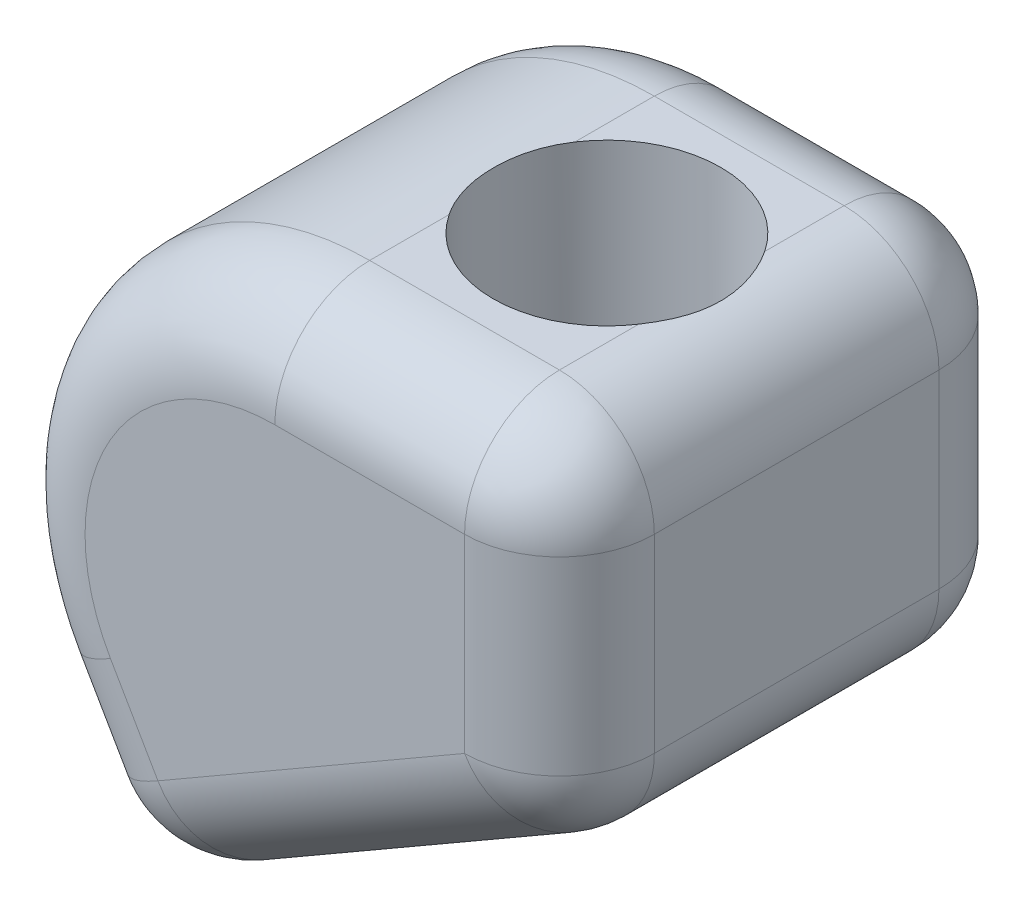
ISO-10303-21;
HEADER;
FILE_DESCRIPTION(('STEP AP214'),'2;1');
FILE_NAME('part.step','',(''),(''),'','','');
FILE_SCHEMA(('AUTOMOTIVE_DESIGN { 1 0 10303 214 1 1 1 1 }'));
ENDSEC;
DATA;
#1=APPLICATION_CONTEXT('core data for automotive mechanical design processes');
#2=APPLICATION_PROTOCOL_DEFINITION('international standard','automotive_design',2000,#1);
#3=PRODUCT_CONTEXT('',#1,'mechanical');
#4=PRODUCT('Part','Part','',(#3));
#5=PRODUCT_RELATED_PRODUCT_CATEGORY('part','',(#4));
#6=PRODUCT_DEFINITION_FORMATION('','',#4);
#7=PRODUCT_DEFINITION_CONTEXT('part definition',#1,'design');
#8=PRODUCT_DEFINITION('design','',#6,#7);
#9=PRODUCT_DEFINITION_SHAPE('','',#8);
#10=(LENGTH_UNIT() NAMED_UNIT(*) SI_UNIT(.MILLI.,.METRE.));
#11=(NAMED_UNIT(*) PLANE_ANGLE_UNIT() SI_UNIT($,.RADIAN.));
#12=(NAMED_UNIT(*) SI_UNIT($,.STERADIAN.) SOLID_ANGLE_UNIT());
#13=UNCERTAINTY_MEASURE_WITH_UNIT(LENGTH_MEASURE(1.E-05),#10,'distance_accuracy_value','');
#14=(GEOMETRIC_REPRESENTATION_CONTEXT(3) GLOBAL_UNCERTAINTY_ASSIGNED_CONTEXT((#13)) GLOBAL_UNIT_ASSIGNED_CONTEXT((#10,
#11,#12)) REPRESENTATION_CONTEXT('',''));
#15=CARTESIAN_POINT('',(0.,0.,0.));
#16=DIRECTION('',(0.,0.,1.));
#17=DIRECTION('',(1.,0.,0.));
#18=AXIS2_PLACEMENT_3D('',#15,#16,#17);
#19=CARTESIAN_POINT('',(173.107004545534,-32.3660254037844,0.));
#20=DIRECTION('',(-0.866025403784436,-0.500000000000005,0.));
#21=DIRECTION('',(0.500000000000005,-0.866025403784436,0.));
#22=AXIS2_PLACEMENT_3D('',#19,#20,#21);
#23=PLANE('',#22);
#24=CARTESIAN_POINT('',(172.857004545534,-31.9330127018922,0.));
#25=DIRECTION('',(-0.866025403784436,-0.500000000000005,0.));
#26=DIRECTION('',(0.500000000000005,-0.866025403784436,0.));
#27=AXIS2_PLACEMENT_3D('',#24,#25,#26);
#28=CIRCLE('',#27,0.95);
#29=CARTESIAN_POINT('',(173.107004545534,-32.3660254037844,0.807774721070179));
#30=VERTEX_POINT('',#29);
#31=CARTESIAN_POINT('',(172.607004545534,-31.5,0.807774721070209));
#32=VERTEX_POINT('',#31);
#33=EDGE_CURVE('E59',#30,#32,#28,.T.);
#34=ORIENTED_EDGE('',*,*,#33,.F.);
#35=DIRECTION('',(0.,0.,1.));
#36=VECTOR('',#35,1.);
#37=CARTESIAN_POINT('',(173.107004545534,-32.3660254037844,2.5));
#38=LINE('',#37,#36);
#39=CARTESIAN_POINT('',(173.107004545534,-32.3660254037844,1.5));
#40=VERTEX_POINT('',#39);
#41=EDGE_CURVE('E357',#30,#40,#38,.T.);
#42=ORIENTED_EDGE('',*,*,#41,.T.);
#43=DIRECTION('',(-0.500000000000005,0.866025403784436,0.));
#44=VECTOR('',#43,1.);
#45=CARTESIAN_POINT('',(172.607004545534,-31.5,1.5));
#46=LINE('',#45,#44);
#47=CARTESIAN_POINT('',(172.607004545534,-31.5,1.5));
#48=VERTEX_POINT('',#47);
#49=EDGE_CURVE('E352',#40,#48,#46,.T.);
#50=ORIENTED_EDGE('',*,*,#49,.T.);
#51=DIRECTION('',(0.,0.,1.));
#52=VECTOR('',#51,1.);
#53=CARTESIAN_POINT('',(172.607004545534,-31.5,-2.5));
#54=LINE('',#53,#52);
#55=EDGE_CURVE('E330',#32,#48,#54,.T.);
#56=ORIENTED_EDGE('',*,*,#55,.F.);
#57=EDGE_LOOP('',(#34,#42,#50,#56));
#58=FACE_BOUND('',#57,.T.);
#59=ADVANCED_FACE('F39',(#58),#23,.T.);
#60=CARTESIAN_POINT('',(176.205080756888,-30.,0.));
#61=DIRECTION('',(0.,1.,0.));
#62=DIRECTION('',(0.,0.,1.));
#63=AXIS2_PLACEMENT_3D('',#60,#61,#62);
#64=CYLINDRICAL_SURFACE('',#63,1.20000000000001);
#65=CARTESIAN_POINT('',(177.205080756888,-27.,0.663324958071104));
#66=CARTESIAN_POINT('',(177.223642908255,-27.000006067088,0.635347104865788));
#67=CARTESIAN_POINT('',(177.24102001675,-27.0005169058093,0.606595325866834));
#68=CARTESIAN_POINT('',(177.273295536153,-27.0021969514604,0.547759810452876));
#69=CARTESIAN_POINT('',(177.288194619349,-27.003365979445,0.517676438111921));
#70=CARTESIAN_POINT('',(177.31541613504,-27.0060116577531,0.456377168655586));
#71=CARTESIAN_POINT('',(177.327738480937,-27.0074883184122,0.42516123351835));
#72=CARTESIAN_POINT('',(177.349726884125,-27.0104550095034,0.361816050832012));
#73=CARTESIAN_POINT('',(177.359392823785,-27.0119450405246,0.329686762907029));
#74=CARTESIAN_POINT('',(177.384298140882,-27.0160405571358,0.232232647890782));
#75=CARTESIAN_POINT('',(177.395465449669,-27.0182742350813,0.165795459334396));
#76=CARTESIAN_POINT('',(177.406530274271,-27.0204848435349,0.0320153299910142));
#77=CARTESIAN_POINT('',(177.406434315144,-27.0204630806699,-0.0353270637795341));
#78=CARTESIAN_POINT('',(177.395062797336,-27.0181964376261,-0.168423679810111));
#79=CARTESIAN_POINT('',(177.383884278799,-27.01597085455,-0.23418661343596));
#80=CARTESIAN_POINT('',(177.350814401043,-27.0105358896632,-0.362912178403207));
#81=CARTESIAN_POINT('',(177.32892770911,-27.0073269366933,-0.425876016732469));
#82=CARTESIAN_POINT('',(177.288358641823,-27.003380894703,-0.517344652398643));
#83=CARTESIAN_POINT('',(177.273415286192,-27.0022050797836,-0.547535647688195));
#84=CARTESIAN_POINT('',(177.241069125215,-27.0005175884638,-0.606511643055718));
#85=CARTESIAN_POINT('',(177.223671158507,-27.0000046251606,-0.635299262802479));
#86=CARTESIAN_POINT('',(177.205080756888,-27.,-0.663324958071109));
#87=B_SPLINE_CURVE_WITH_KNOTS('',3,(#65,#66,#67,#68,#69,#70,#71,#72,#73,#74,#75,#76,#77,#78,#79,
#80,#81,#82,#83,#84,#85,#86),.UNSPECIFIED.,.F.,.F.,(4,2,2,2,2,2,2,2,2,2,4),(0.,0.1006784361742,
0.201329513628929,0.301983973225776,0.40264288931717,0.60381107246861,0.804862715079196,
1.00416933751299,1.20338916708364,1.3044021943411,1.40521881229677),.UNSPECIFIED.);
#88=CARTESIAN_POINT('',(177.205080756888,-27.,0.663324958071104));
#89=VERTEX_POINT('',#88);
#90=CARTESIAN_POINT('',(177.205080756888,-27.,-0.663324958071104));
#91=VERTEX_POINT('',#90);
#92=EDGE_CURVE('E178',#89,#91,#87,.T.);
#93=ORIENTED_EDGE('',*,*,#92,.T.);
#94=CARTESIAN_POINT('',(176.205080756888,-27.,0.));
#95=DIRECTION('',(0.,1.,0.));
#96=DIRECTION('',(0.,0.,1.));
#97=AXIS2_PLACEMENT_3D('',#94,#95,#96);
#98=CIRCLE('',#97,1.20000000000001);
#99=CARTESIAN_POINT('',(175.205080756888,-27.,-0.663324958071146));
#100=VERTEX_POINT('',#99);
#101=EDGE_CURVE('E179',#91,#100,#98,.T.);
#102=ORIENTED_EDGE('',*,*,#101,.T.);
#103=CARTESIAN_POINT('',(175.205080756888,-27.,-0.663324958071104));
#104=CARTESIAN_POINT('',(175.194305111385,-26.9999999997256,-0.647080796316611));
#105=CARTESIAN_POINT('',(175.183925969476,-27.0000154491121,-0.630573665284858));
#106=CARTESIAN_POINT('',(175.163983800487,-27.0000772462285,-0.597073574415001));
#107=CARTESIAN_POINT('',(175.154420775459,-27.000123594036,-0.580080613356132));
#108=CARTESIAN_POINT('',(175.136133956309,-27.0002471873265,-0.545648967700709));
#109=CARTESIAN_POINT('',(175.127410166405,-27.0003244329648,-0.528210280864417));
#110=CARTESIAN_POINT('',(175.110822419231,-27.000509825101,-0.492928657336636));
#111=CARTESIAN_POINT('',(175.102958468443,-27.0006179718319,-0.47508571759858));
#112=CARTESIAN_POINT('',(175.088109099241,-27.0008651536184,-0.43903793837959));
#113=CARTESIAN_POINT('',(175.081123689657,-27.0010041889845,-0.420833095262795));
#114=CARTESIAN_POINT('',(175.068047979046,-27.0013131945317,-0.384104741145912));
#115=CARTESIAN_POINT('',(175.061957689266,-27.0014831651015,-0.365581226144888));
#116=CARTESIAN_POINT('',(175.050686678983,-27.0018538671609,-0.328259509192469));
#117=CARTESIAN_POINT('',(175.045505972194,-27.0020545991143,-0.309461303103923));
#118=CARTESIAN_POINT('',(175.036066426232,-27.0024874725795,-0.27163484373975));
#119=CARTESIAN_POINT('',(175.031807603275,-27.0027196146437,-0.252606586423665));
#120=CARTESIAN_POINT('',(175.024221934676,-27.0032128871459,-0.214365190453443));
#121=CARTESIAN_POINT('',(175.020895107768,-27.0034740181666,-0.195152048090723));
#122=CARTESIAN_POINT('',(175.015181329199,-27.0040343044712,-0.156586559513756));
#123=CARTESIAN_POINT('',(175.012794398792,-27.0043334606148,-0.137234210161582));
#124=CARTESIAN_POINT('',(175.008966074247,-27.0049360732552,-0.0984360438122633));
#125=CARTESIAN_POINT('',(175.007524703865,-27.0052395298598,-0.0789902244790649));
#126=CARTESIAN_POINT('',(175.005590934782,-27.0059766071477,-0.0400520895663343));
#127=CARTESIAN_POINT('',(175.005098562307,-27.0064102314277,-0.0205597727167371));
#128=CARTESIAN_POINT('',(175.005073215793,-27.0067960601635,0.00794824540138099));
#129=CARTESIAN_POINT('',(175.005166783616,-27.0068817521076,0.0169629209059025));
#130=CARTESIAN_POINT('',(175.005647963921,-27.0069778318849,0.039186066127163));
#131=CARTESIAN_POINT('',(175.006152225847,-27.0069345618967,0.05239240275937));
#132=CARTESIAN_POINT('',(175.007826140189,-27.0067884239001,0.0829736535245392));
#133=CARTESIAN_POINT('',(175.009156315381,-27.0066709866535,0.100339659214397));
#134=CARTESIAN_POINT('',(175.012983181799,-27.0063470311352,0.139177431370251));
#135=CARTESIAN_POINT('',(175.015683815731,-27.0061258608674,0.16062948046226));
#136=CARTESIAN_POINT('',(175.020838970297,-27.0057477865877,0.194228622369956));
#137=CARTESIAN_POINT('',(175.022906010712,-27.0056037767223,0.206436871302088));
#138=CARTESIAN_POINT('',(175.027608209231,-27.005291680665,0.23181618995519));
#139=CARTESIAN_POINT('',(175.030276678909,-27.0051225883804,0.244981120102627));
#140=CARTESIAN_POINT('',(175.036279840069,-27.004761195887,0.272239077119979));
#141=CARTESIAN_POINT('',(175.039650303705,-27.0045681147538,0.286324211041982));
#142=CARTESIAN_POINT('',(175.047161598947,-27.0041561441238,0.315379773486248));
#143=CARTESIAN_POINT('',(175.051340566024,-27.0039363984017,0.3303403517346));
#144=CARTESIAN_POINT('',(175.059841685132,-27.003517052391,0.358641960638019));
#145=CARTESIAN_POINT('',(175.064110437755,-27.0033175700797,0.371999066684844));
#146=CARTESIAN_POINT('',(175.072866813951,-27.0029380866788,0.397828122106709));
#147=CARTESIAN_POINT('',(175.077329635547,-27.0027576170323,0.410308475736956));
#148=CARTESIAN_POINT('',(175.086395727177,-27.0024137763855,0.434395738830709));
#149=CARTESIAN_POINT('',(175.09097586508,-27.0022500206076,0.44601134752691));
#150=CARTESIAN_POINT('',(175.100203340571,-27.0019403255413,0.46838359070755));
#151=CARTESIAN_POINT('',(175.104829205881,-27.0017939099643,0.479149104263959));
#152=CARTESIAN_POINT('',(175.118236291389,-27.0013948858097,0.509131968171));
#153=CARTESIAN_POINT('',(175.127370928726,-27.0011514353377,0.528193003970845));
#154=CARTESIAN_POINT('',(175.145232683772,-27.0007389139232,0.563070314031714));
#155=CARTESIAN_POINT('',(175.153825934951,-27.0005641750177,0.578955401091379));
#156=CARTESIAN_POINT('',(175.170198194576,-27.0002873470645,0.607653323804304));
#157=CARTESIAN_POINT('',(175.177866963556,-27.0001779555169,0.620529014120877));
#158=CARTESIAN_POINT('',(175.192059930087,-27.0000438130451,0.643374503247547));
#159=CARTESIAN_POINT('',(175.198496403024,-27.0000063063468,0.653398811915576));
#160=CARTESIAN_POINT('',(175.205080756888,-27.,0.663324958071098));
#161=B_SPLINE_CURVE_WITH_KNOTS('',3,(#103,#104,#105,#106,#107,#108,#109,#110,#111,#112,#113,
#114,#115,#116,#117,#118,#119,#120,#121,#122,#123,#124,#125,#126,#127,#128,#129,#130,#131,#132,
#133,#134,#135,#136,#137,#138,#139,#140,#141,#142,#143,#144,#145,#146,#147,#148,#149,#150,#151,
#152,#153,#154,#155,#156,#157,#158,#159,#160),.UNSPECIFIED.,.F.,.F.,(4,2,2,2,2,2,2,2,2,2,2,2,2,
2,2,2,2,2,2,2,2,2,2,2,2,2,2,2,4),(0.,0.058473940111508,0.116948027165864,0.175422408106049,
0.23389722987286,0.292372639403764,0.350848783631776,0.409325809484408,0.467803863882491,
0.526283093739127,0.584763645958554,0.643245667435041,0.701729305051791,0.728773776717201,
0.768413578703062,0.820649822411924,0.885481987898004,0.922625573129558,0.962918826077028,
1.00636170702536,1.05295416482459,1.09501785435463,1.1347771511726,1.1722320289373,
1.20738246545634,1.27076442667195,1.32493056463976,1.36988034814605,1.40561358886887),.UNSPECIFIED.);
#162=CARTESIAN_POINT('',(175.205080756888,-27.,0.663324958071146));
#163=VERTEX_POINT('',#162);
#164=EDGE_CURVE('E170',#100,#163,#161,.T.);
#165=ORIENTED_EDGE('',*,*,#164,.T.);
#166=EDGE_CURVE('E183',#163,#89,#98,.T.);
#167=ORIENTED_EDGE('',*,*,#166,.T.);
#168=EDGE_LOOP('',(#93,#102,#165,#167));
#169=FACE_BOUND('',#168,.T.);
#170=CARTESIAN_POINT('',(176.205080756888,-31.7320508075688,0.));
#171=DIRECTION('',(-0.866025403784436,-0.500000000000005,0.));
#172=DIRECTION('',(-0.500000000000005,0.866025403784436,0.));
#173=AXIS2_PLACEMENT_3D('',#170,#171,#172);
#174=ELLIPSE('',#173,2.40000000000001,1.20000000000001);
#175=CARTESIAN_POINT('',(175.205080756888,-30.,-0.663324958071146));
#176=VERTEX_POINT('',#175);
#177=CARTESIAN_POINT('',(175.205080756888,-30.,0.663324958071146));
#178=VERTEX_POINT('',#177);
#179=EDGE_CURVE('E66',#176,#178,#174,.F.);
#180=ORIENTED_EDGE('',*,*,#179,.F.);
#181=CARTESIAN_POINT('',(176.205080756888,-30.,0.));
#182=DIRECTION('',(0.,1.,0.));
#183=DIRECTION('',(0.,0.,1.));
#184=AXIS2_PLACEMENT_3D('',#181,#182,#183);
#185=CIRCLE('',#184,1.20000000000001);
#186=EDGE_CURVE('E173',#178,#176,#185,.T.);
#187=ORIENTED_EDGE('',*,*,#186,.F.);
#188=EDGE_LOOP('',(#180,#187));
#189=FACE_BOUND('',#188,.T.);
#190=ADVANCED_FACE('F172',(#169,#189),#64,.F.);
#191=CARTESIAN_POINT('',(176.205080756888,-30.,0.));
#192=DIRECTION('',(0.,1.,0.));
#193=DIRECTION('',(0.,0.,1.));
#194=AXIS2_PLACEMENT_3D('',#191,#192,#193);
#195=PLANE('',#194);
#196=ORIENTED_EDGE('',*,*,#186,.T.);
#197=DIRECTION('',(0.,0.,1.));
#198=VECTOR('',#197,1.);
#199=CARTESIAN_POINT('',(175.205080756888,-30.,0.));
#200=LINE('',#199,#198);
#201=EDGE_CURVE('E53',#176,#178,#200,.T.);
#202=ORIENTED_EDGE('',*,*,#201,.T.);
#203=EDGE_LOOP('',(#196,#202));
#204=FACE_BOUND('',#203,.T.);
#205=ADVANCED_FACE('F177',(#204),#195,.T.);
#206=CARTESIAN_POINT('',(177.205080756888,-27.,1.5));
#207=DIRECTION('',(0.,1.,0.));
#208=DIRECTION('',(0.,0.,1.));
#209=AXIS2_PLACEMENT_3D('',#206,#207,#208);
#210=PLANE('',#209);
#211=ORIENTED_EDGE('',*,*,#101,.F.);
#212=DIRECTION('',(0.,0.,1.));
#213=VECTOR('',#212,1.);
#214=CARTESIAN_POINT('',(177.205080756888,-27.,-2.5));
#215=LINE('',#214,#213);
#216=CARTESIAN_POINT('',(177.205080756888,-27.,-1.5));
#217=VERTEX_POINT('',#216);
#218=EDGE_CURVE('E366',#91,#217,#215,.F.);
#219=ORIENTED_EDGE('',*,*,#218,.T.);
#220=DIRECTION('',(-1.,0.,0.));
#221=VECTOR('',#220,1.);
#222=CARTESIAN_POINT('',(175.205080756888,-27.,-1.5));
#223=LINE('',#222,#221);
#224=CARTESIAN_POINT('',(175.205080756888,-27.,-1.5));
#225=VERTEX_POINT('',#224);
#226=EDGE_CURVE('E367',#217,#225,#223,.T.);
#227=ORIENTED_EDGE('',*,*,#226,.T.);
#228=DIRECTION('',(0.,0.,1.));
#229=VECTOR('',#228,1.);
#230=CARTESIAN_POINT('',(175.205080756888,-27.,-2.5));
#231=LINE('',#230,#229);
#232=EDGE_CURVE('E312',#225,#100,#231,.T.);
#233=ORIENTED_EDGE('',*,*,#232,.T.);
#234=EDGE_LOOP('',(#211,#219,#227,#233));
#235=FACE_BOUND('',#234,.T.);
#236=ADVANCED_FACE('F229',(#235),#210,.T.);
#237=CARTESIAN_POINT('',(172.607004545534,-31.5,-0.807774721070209));
#238=VERTEX_POINT('',#237);
#239=CARTESIAN_POINT('',(173.107004545534,-32.3660254037844,-0.807774721070179));
#240=VERTEX_POINT('',#239);
#241=EDGE_CURVE('E513',#238,#240,#28,.T.);
#242=ORIENTED_EDGE('',*,*,#241,.F.);
#243=CARTESIAN_POINT('',(172.607004545534,-31.5,-1.5));
#244=VERTEX_POINT('',#243);
#245=EDGE_CURVE('E327',#244,#238,#54,.T.);
#246=ORIENTED_EDGE('',*,*,#245,.F.);
#247=DIRECTION('',(-0.500000000000005,0.866025403784436,0.));
#248=VECTOR('',#247,1.);
#249=CARTESIAN_POINT('',(115.815353299545,66.8660254037847,-1.5));
#250=LINE('',#249,#248);
#251=CARTESIAN_POINT('',(173.107004545534,-32.3660254037844,-1.5));
#252=VERTEX_POINT('',#251);
#253=EDGE_CURVE('E358',#244,#252,#250,.F.);
#254=ORIENTED_EDGE('',*,*,#253,.T.);
#255=EDGE_CURVE('E354',#252,#240,#38,.T.);
#256=ORIENTED_EDGE('',*,*,#255,.T.);
#257=EDGE_LOOP('',(#242,#246,#254,#256));
#258=FACE_BOUND('',#257,.T.);
#259=ADVANCED_FACE('F41',(#258),#23,.T.);
#260=ORIENTED_EDGE('',*,*,#166,.F.);
#261=CARTESIAN_POINT('',(175.205080756888,-27.,1.5));
#262=VERTEX_POINT('',#261);
#263=EDGE_CURVE('E322',#163,#262,#231,.T.);
#264=ORIENTED_EDGE('',*,*,#263,.T.);
#265=DIRECTION('',(-1.,0.,0.));
#266=VECTOR('',#265,1.);
#267=CARTESIAN_POINT('',(0.,-27.,1.5));
#268=LINE('',#267,#266);
#269=CARTESIAN_POINT('',(177.205080756888,-27.,1.5));
#270=VERTEX_POINT('',#269);
#271=EDGE_CURVE('E361',#262,#270,#268,.F.);
#272=ORIENTED_EDGE('',*,*,#271,.T.);
#273=EDGE_CURVE('E363',#270,#89,#215,.F.);
#274=ORIENTED_EDGE('',*,*,#273,.T.);
#275=EDGE_LOOP('',(#260,#264,#272,#274));
#276=FACE_BOUND('',#275,.T.);
#277=ADVANCED_FACE('F227',(#276),#210,.T.);
#278=CARTESIAN_POINT('',(177.205080756888,-30.,1.5));
#279=DIRECTION('',(0.,0.,1.));
#280=DIRECTION('',(1.,0.,0.));
#281=AXIS2_PLACEMENT_3D('',#278,#279,#280);
#282=SPHERICAL_SURFACE('',#281,1.);
#283=CARTESIAN_POINT('',(177.205080756888,-30.,1.5));
#284=DIRECTION('',(0.,0.,1.));
#285=DIRECTION('',(1.,0.,0.));
#286=AXIS2_PLACEMENT_3D('',#283,#284,#285);
#287=CIRCLE('',#286,1.);
#288=CARTESIAN_POINT('',(178.205080756888,-30.,1.5));
#289=VERTEX_POINT('',#288);
#290=CARTESIAN_POINT('',(177.705080756888,-30.8660254037844,1.5));
#291=VERTEX_POINT('',#290);
#292=EDGE_CURVE('E445',#289,#291,#287,.F.);
#293=ORIENTED_EDGE('',*,*,#292,.F.);
#294=CARTESIAN_POINT('',(177.205080756888,-30.,1.5));
#295=DIRECTION('',(0.,-1.,0.));
#296=DIRECTION('',(0.,0.,-1.));
#297=AXIS2_PLACEMENT_3D('',#294,#295,#296);
#298=CIRCLE('',#297,1.);
#299=CARTESIAN_POINT('',(177.205080756888,-30.,2.5));
#300=VERTEX_POINT('',#299);
#301=EDGE_CURVE('E321',#300,#289,#298,.F.);
#302=ORIENTED_EDGE('',*,*,#301,.F.);
#303=CARTESIAN_POINT('',(177.205080756888,-30.,1.5));
#304=DIRECTION('',(0.866025403784458,0.499999999999966,0.));
#305=DIRECTION('',(-0.499999999999966,0.866025403784458,0.));
#306=AXIS2_PLACEMENT_3D('',#303,#304,#305);
#307=CIRCLE('',#306,1.);
#308=EDGE_CURVE('E448',#291,#300,#307,.F.);
#309=ORIENTED_EDGE('',*,*,#308,.F.);
#310=EDGE_LOOP('',(#293,#302,#309));
#311=FACE_BOUND('',#310,.T.);
#312=ADVANCED_FACE('F223',(#311),#282,.T.);
#313=CARTESIAN_POINT('',(177.205080756888,-30.,-1.5));
#314=DIRECTION('',(0.,0.,1.));
#315=DIRECTION('',(1.,0.,0.));
#316=AXIS2_PLACEMENT_3D('',#313,#314,#315);
#317=SPHERICAL_SURFACE('',#316,1.);
#318=CARTESIAN_POINT('',(177.205080756888,-30.,-1.5));
#319=DIRECTION('',(0.866025403784439,0.5,0.));
#320=DIRECTION('',(-0.5,0.866025403784439,0.));
#321=AXIS2_PLACEMENT_3D('',#318,#319,#320);
#322=CIRCLE('',#321,1.);
#323=CARTESIAN_POINT('',(177.205080756888,-30.,-2.5));
#324=VERTEX_POINT('',#323);
#325=CARTESIAN_POINT('',(177.705080756888,-30.8660254037844,-1.5));
#326=VERTEX_POINT('',#325);
#327=EDGE_CURVE('E420',#324,#326,#322,.F.);
#328=ORIENTED_EDGE('',*,*,#327,.F.);
#329=CARTESIAN_POINT('',(177.205080756888,-30.,-1.5));
#330=DIRECTION('',(0.,-1.,0.));
#331=DIRECTION('',(0.,0.,-1.));
#332=AXIS2_PLACEMENT_3D('',#329,#330,#331);
#333=CIRCLE('',#332,1.);
#334=CARTESIAN_POINT('',(178.205080756888,-30.,-1.5));
#335=VERTEX_POINT('',#334);
#336=EDGE_CURVE('E428',#335,#324,#333,.F.);
#337=ORIENTED_EDGE('',*,*,#336,.F.);
#338=CARTESIAN_POINT('',(177.205080756888,-30.,-1.5));
#339=DIRECTION('',(0.,0.,-1.));
#340=DIRECTION('',(-1.,0.,0.));
#341=AXIS2_PLACEMENT_3D('',#338,#339,#340);
#342=CIRCLE('',#341,1.);
#343=EDGE_CURVE('E431',#335,#326,#342,.T.);
#344=ORIENTED_EDGE('',*,*,#343,.T.);
#345=EDGE_LOOP('',(#328,#337,#344));
#346=FACE_BOUND('',#345,.T.);
#347=ADVANCED_FACE('F226',(#346),#317,.T.);
#348=CARTESIAN_POINT('',(177.205080756888,-30.,-2.5));
#349=DIRECTION('',(0.,0.,-1.));
#350=DIRECTION('',(-1.,0.,0.));
#351=AXIS2_PLACEMENT_3D('',#348,#349,#350);
#352=CYLINDRICAL_SURFACE('',#351,1.);
#353=ORIENTED_EDGE('',*,*,#292,.T.);
#354=DIRECTION('',(0.,0.,1.));
#355=VECTOR('',#354,1.);
#356=CARTESIAN_POINT('',(177.705080756888,-30.8660254037844,2.5));
#357=LINE('',#356,#355);
#358=EDGE_CURVE('E372',#326,#291,#357,.T.);
#359=ORIENTED_EDGE('',*,*,#358,.F.);
#360=ORIENTED_EDGE('',*,*,#343,.F.);
#361=DIRECTION('',(0.,0.,1.));
#362=VECTOR('',#361,1.);
#363=CARTESIAN_POINT('',(178.205080756888,-30.,-2.5));
#364=LINE('',#363,#362);
#365=EDGE_CURVE('E383',#289,#335,#364,.F.);
#366=ORIENTED_EDGE('',*,*,#365,.F.);
#367=EDGE_LOOP('',(#353,#359,#360,#366));
#368=FACE_BOUND('',#367,.T.);
#369=ADVANCED_FACE('F234',(#368),#352,.T.);
#370=CARTESIAN_POINT('',(177.205080756888,1.37488046971023E-12,1.5));
#371=DIRECTION('',(0.,1.,0.));
#372=DIRECTION('',(-1.,0.,0.));
#373=AXIS2_PLACEMENT_3D('',#370,#371,#372);
#374=CYLINDRICAL_SURFACE('',#373,1.);
#375=ORIENTED_EDGE('',*,*,#301,.T.);
#376=DIRECTION('',(0.,-1.,0.));
#377=VECTOR('',#376,1.);
#378=CARTESIAN_POINT('',(178.205080756888,-30.5773502691896,1.5));
#379=LINE('',#378,#377);
#380=CARTESIAN_POINT('',(178.205080756888,-28.,1.5));
#381=VERTEX_POINT('',#380);
#382=EDGE_CURVE('E379',#381,#289,#379,.T.);
#383=ORIENTED_EDGE('',*,*,#382,.F.);
#384=CARTESIAN_POINT('',(177.205080756888,-28.,1.5));
#385=DIRECTION('',(0.,1.,0.));
#386=DIRECTION('',(-1.,0.,0.));
#387=AXIS2_PLACEMENT_3D('',#384,#385,#386);
#388=CIRCLE('',#387,1.);
#389=CARTESIAN_POINT('',(177.205080756888,-28.,2.5));
#390=VERTEX_POINT('',#389);
#391=EDGE_CURVE('E442',#390,#381,#388,.T.);
#392=ORIENTED_EDGE('',*,*,#391,.F.);
#393=DIRECTION('',(0.,-1.,0.));
#394=VECTOR('',#393,1.);
#395=CARTESIAN_POINT('',(177.205080756888,-27.,2.5));
#396=LINE('',#395,#394);
#397=EDGE_CURVE('E181',#300,#390,#396,.F.);
#398=ORIENTED_EDGE('',*,*,#397,.F.);
#399=EDGE_LOOP('',(#375,#383,#392,#398));
#400=FACE_BOUND('',#399,.T.);
#401=ADVANCED_FACE('F230',(#400),#374,.T.);
#402=CARTESIAN_POINT('',(57.2916512459886,-99.2320508075689,1.5));
#403=DIRECTION('',(0.866025403784438,0.500000000000001,0.));
#404=DIRECTION('',(-0.500000000000001,0.866025403784438,0.));
#405=AXIS2_PLACEMENT_3D('',#402,#403,#404);
#406=CYLINDRICAL_SURFACE('',#405,1.);
#407=ORIENTED_EDGE('',*,*,#308,.T.);
#408=DIRECTION('',(0.866025403784438,0.500000000000001,0.));
#409=VECTOR('',#408,1.);
#410=CARTESIAN_POINT('',(57.2916512459886,-99.2320508075689,2.5));
#411=LINE('',#410,#409);
#412=CARTESIAN_POINT('',(173.973029949319,-31.8660254037844,2.5));
#413=VERTEX_POINT('',#412);
#414=EDGE_CURVE('E394',#413,#300,#411,.T.);
#415=ORIENTED_EDGE('',*,*,#414,.F.);
#416=CARTESIAN_POINT('',(173.973029949319,-31.8660254037844,1.5));
#417=DIRECTION('',(-0.866025403784438,-0.500000000000002,0.));
#418=DIRECTION('',(0.500000000000002,-0.866025403784438,0.));
#419=AXIS2_PLACEMENT_3D('',#416,#417,#418);
#420=CIRCLE('',#419,1.);
#421=CARTESIAN_POINT('',(174.473029949319,-32.7320508075689,1.5));
#422=VERTEX_POINT('',#421);
#423=EDGE_CURVE('E434',#422,#413,#420,.T.);
#424=ORIENTED_EDGE('',*,*,#423,.F.);
#425=DIRECTION('',(0.866025403784438,0.500000000000001,0.));
#426=VECTOR('',#425,1.);
#427=CARTESIAN_POINT('',(57.7916512459886,-100.098076211353,1.5));
#428=LINE('',#427,#426);
#429=EDGE_CURVE('E370',#291,#422,#428,.F.);
#430=ORIENTED_EDGE('',*,*,#429,.F.);
#431=EDGE_LOOP('',(#407,#415,#424,#430));
#432=FACE_BOUND('',#431,.T.);
#433=ADVANCED_FACE('F233',(#432),#406,.T.);
#434=CARTESIAN_POINT('',(177.205080756888,1.37488046971023E-12,-1.5));
#435=DIRECTION('',(0.,-1.,0.));
#436=DIRECTION('',(1.,0.,0.));
#437=AXIS2_PLACEMENT_3D('',#434,#435,#436);
#438=CYLINDRICAL_SURFACE('',#437,1.);
#439=ORIENTED_EDGE('',*,*,#336,.T.);
#440=DIRECTION('',(0.,-1.,0.));
#441=VECTOR('',#440,1.);
#442=CARTESIAN_POINT('',(177.205080756888,1.37488046971023E-12,-2.5));
#443=LINE('',#442,#441);
#444=CARTESIAN_POINT('',(177.205080756888,-28.,-2.5));
#445=VERTEX_POINT('',#444);
#446=EDGE_CURVE('E339',#445,#324,#443,.T.);
#447=ORIENTED_EDGE('',*,*,#446,.F.);
#448=CARTESIAN_POINT('',(177.205080756888,-28.,-1.5));
#449=DIRECTION('',(0.,1.,0.));
#450=DIRECTION('',(-1.,0.,0.));
#451=AXIS2_PLACEMENT_3D('',#448,#449,#450);
#452=CIRCLE('',#451,1.);
#453=CARTESIAN_POINT('',(178.205080756888,-28.,-1.5));
#454=VERTEX_POINT('',#453);
#455=EDGE_CURVE('E417',#454,#445,#452,.T.);
#456=ORIENTED_EDGE('',*,*,#455,.F.);
#457=DIRECTION('',(0.,-1.,0.));
#458=VECTOR('',#457,1.);
#459=CARTESIAN_POINT('',(178.205080756888,1.38263916637873E-12,-1.5));
#460=LINE('',#459,#458);
#461=EDGE_CURVE('E385',#335,#454,#460,.F.);
#462=ORIENTED_EDGE('',*,*,#461,.F.);
#463=EDGE_LOOP('',(#439,#447,#456,#462));
#464=FACE_BOUND('',#463,.T.);
#465=ADVANCED_FACE('F246',(#464),#438,.T.);
#466=CARTESIAN_POINT('',(57.2916512459886,-99.2320508075689,-1.5));
#467=DIRECTION('',(-0.866025403784438,-0.500000000000001,0.));
#468=DIRECTION('',(0.500000000000001,-0.866025403784438,0.));
#469=AXIS2_PLACEMENT_3D('',#466,#467,#468);
#470=CYLINDRICAL_SURFACE('',#469,1.);
#471=ORIENTED_EDGE('',*,*,#327,.T.);
#472=DIRECTION('',(0.866025403784438,0.500000000000001,0.));
#473=VECTOR('',#472,1.);
#474=CARTESIAN_POINT('',(178.205080756888,-30.5773502691896,-1.5));
#475=LINE('',#474,#473);
#476=CARTESIAN_POINT('',(174.473029949319,-32.7320508075689,-1.5));
#477=VERTEX_POINT('',#476);
#478=EDGE_CURVE('E376',#477,#326,#475,.T.);
#479=ORIENTED_EDGE('',*,*,#478,.F.);
#480=CARTESIAN_POINT('',(173.973029949319,-31.8660254037844,-1.5));
#481=DIRECTION('',(-0.86602540378444,-0.499999999999999,0.));
#482=DIRECTION('',(0.499999999999999,-0.866025403784439,0.));
#483=AXIS2_PLACEMENT_3D('',#480,#481,#482);
#484=CIRCLE('',#483,1.);
#485=CARTESIAN_POINT('',(173.973029949319,-31.8660254037844,-2.5));
#486=VERTEX_POINT('',#485);
#487=EDGE_CURVE('E409',#486,#477,#484,.T.);
#488=ORIENTED_EDGE('',*,*,#487,.F.);
#489=DIRECTION('',(0.866025403784438,0.500000000000001,0.));
#490=VECTOR('',#489,1.);
#491=CARTESIAN_POINT('',(173.107004545534,-32.3660254037844,-2.5));
#492=LINE('',#491,#490);
#493=EDGE_CURVE('E341',#324,#486,#492,.F.);
#494=ORIENTED_EDGE('',*,*,#493,.F.);
#495=EDGE_LOOP('',(#471,#479,#488,#494));
#496=FACE_BOUND('',#495,.T.);
#497=ADVANCED_FACE('F266',(#496),#470,.T.);
#498=CARTESIAN_POINT('',(0.,0.,2.5));
#499=DIRECTION('',(0.,0.,1.));
#500=DIRECTION('',(1.,0.,0.));
#501=AXIS2_PLACEMENT_3D('',#498,#499,#500);
#502=PLANE('',#501);
#503=ORIENTED_EDGE('',*,*,#414,.T.);
#504=ORIENTED_EDGE('',*,*,#397,.T.);
#505=DIRECTION('',(-1.,0.,0.));
#506=VECTOR('',#505,1.);
#507=CARTESIAN_POINT('',(0.,-28.,2.5));
#508=LINE('',#507,#506);
#509=CARTESIAN_POINT('',(175.205080756888,-28.,2.5));
#510=VERTEX_POINT('',#509);
#511=EDGE_CURVE('E388',#390,#510,#508,.T.);
#512=ORIENTED_EDGE('',*,*,#511,.T.);
#513=CARTESIAN_POINT('',(175.205080756888,-30.,2.5));
#514=DIRECTION('',(0.,0.,1.));
#515=DIRECTION('',(1.,0.,0.));
#516=AXIS2_PLACEMENT_3D('',#513,#514,#515);
#517=CIRCLE('',#516,2.00000000000003);
#518=CARTESIAN_POINT('',(173.473029949319,-31.,2.5));
#519=VERTEX_POINT('',#518);
#520=EDGE_CURVE('E390',#510,#519,#517,.T.);
#521=ORIENTED_EDGE('',*,*,#520,.T.);
#522=DIRECTION('',(-0.500000000000005,0.866025403784436,0.));
#523=VECTOR('',#522,1.);
#524=CARTESIAN_POINT('',(174.473029949319,-32.7320508075689,2.5));
#525=LINE('',#524,#523);
#526=EDGE_CURVE('E392',#519,#413,#525,.F.);
#527=ORIENTED_EDGE('',*,*,#526,.T.);
#528=EDGE_LOOP('',(#503,#504,#512,#521,#527));
#529=FACE_BOUND('',#528,.T.);
#530=ADVANCED_FACE('F260',(#529),#502,.T.);
#531=CARTESIAN_POINT('',(173.973029949319,-31.8660254037844,1.5));
#532=DIRECTION('',(0.,0.,1.));
#533=DIRECTION('',(1.,0.,0.));
#534=AXIS2_PLACEMENT_3D('',#531,#532,#533);
#535=SPHERICAL_SURFACE('',#534,1.);
#536=ORIENTED_EDGE('',*,*,#423,.T.);
#537=CARTESIAN_POINT('',(173.973029949319,-31.8660254037844,1.5));
#538=DIRECTION('',(0.499999999999993,-0.866025403784442,0.));
#539=DIRECTION('',(0.866025403784442,0.499999999999993,0.));
#540=AXIS2_PLACEMENT_3D('',#537,#538,#539);
#541=CIRCLE('',#540,1.);
#542=EDGE_CURVE('E437',#413,#40,#541,.T.);
#543=ORIENTED_EDGE('',*,*,#542,.T.);
#544=CARTESIAN_POINT('',(173.973029949319,-31.8660254037844,1.5));
#545=DIRECTION('',(0.,0.,1.));
#546=DIRECTION('',(1.,0.,0.));
#547=AXIS2_PLACEMENT_3D('',#544,#545,#546);
#548=CIRCLE('',#547,1.);
#549=EDGE_CURVE('E422',#422,#40,#548,.F.);
#550=ORIENTED_EDGE('',*,*,#549,.F.);
#551=EDGE_LOOP('',(#536,#543,#550));
#552=FACE_BOUND('',#551,.T.);
#553=ADVANCED_FACE('F256',(#552),#535,.T.);
#554=CARTESIAN_POINT('',(57.7916512459886,-100.098076211353,-2.5));
#555=DIRECTION('',(0.500000000000001,-0.866025403784438,0.));
#556=DIRECTION('',(0.866025403784438,0.500000000000001,0.));
#557=AXIS2_PLACEMENT_3D('',#554,#555,#556);
#558=PLANE('',#557);
#559=DIRECTION('',(0.,0.,1.));
#560=VECTOR('',#559,1.);
#561=CARTESIAN_POINT('',(174.473029949319,-32.7320508075689,-2.5));
#562=LINE('',#561,#560);
#563=EDGE_CURVE('E374',#422,#477,#562,.F.);
#564=ORIENTED_EDGE('',*,*,#563,.T.);
#565=ORIENTED_EDGE('',*,*,#478,.T.);
#566=ORIENTED_EDGE('',*,*,#358,.T.);
#567=ORIENTED_EDGE('',*,*,#429,.T.);
#568=EDGE_LOOP('',(#564,#565,#566,#567));
#569=FACE_BOUND('',#568,.T.);
#570=ADVANCED_FACE('F259',(#569),#558,.T.);
#571=CARTESIAN_POINT('',(0.,0.,-2.5));
#572=DIRECTION('',(0.,0.,1.));
#573=DIRECTION('',(1.,0.,0.));
#574=AXIS2_PLACEMENT_3D('',#571,#572,#573);
#575=PLANE('',#574);
#576=DIRECTION('',(-0.500000000000005,0.866025403784436,0.));
#577=VECTOR('',#576,1.);
#578=CARTESIAN_POINT('',(116.681378703329,67.3660254037847,-2.5));
#579=LINE('',#578,#577);
#580=CARTESIAN_POINT('',(173.473029949319,-31.,-2.5));
#581=VERTEX_POINT('',#580);
#582=EDGE_CURVE('E347',#486,#581,#579,.T.);
#583=ORIENTED_EDGE('',*,*,#582,.T.);
#584=CARTESIAN_POINT('',(175.205080756888,-30.,-2.5));
#585=DIRECTION('',(0.,0.,1.));
#586=DIRECTION('',(1.,0.,0.));
#587=AXIS2_PLACEMENT_3D('',#584,#585,#586);
#588=CIRCLE('',#587,2.00000000000003);
#589=CARTESIAN_POINT('',(175.205080756888,-28.,-2.5));
#590=VERTEX_POINT('',#589);
#591=EDGE_CURVE('E349',#581,#590,#588,.F.);
#592=ORIENTED_EDGE('',*,*,#591,.T.);
#593=DIRECTION('',(-1.,0.,0.));
#594=VECTOR('',#593,1.);
#595=CARTESIAN_POINT('',(178.205080756888,-28.,-2.5));
#596=LINE('',#595,#594);
#597=EDGE_CURVE('E345',#590,#445,#596,.F.);
#598=ORIENTED_EDGE('',*,*,#597,.T.);
#599=ORIENTED_EDGE('',*,*,#446,.T.);
#600=ORIENTED_EDGE('',*,*,#493,.T.);
#601=EDGE_LOOP('',(#583,#592,#598,#599,#600));
#602=FACE_BOUND('',#601,.T.);
#603=ADVANCED_FACE('F297',(#602),#575,.F.);
#604=CARTESIAN_POINT('',(175.205080756888,-30.,-1.5));
#605=DIRECTION('',(0.,0.,1.));
#606=DIRECTION('',(1.,0.,0.));
#607=AXIS2_PLACEMENT_3D('',#604,#605,#606);
#608=TOROIDAL_SURFACE('',#607,2.00000000000003,1.);
#609=CARTESIAN_POINT('',(175.205080756888,-28.,-1.5));
#610=DIRECTION('',(-1.,0.,0.));
#611=DIRECTION('',(0.,0.,1.));
#612=AXIS2_PLACEMENT_3D('',#609,#610,#611);
#613=CIRCLE('',#612,1.);
#614=EDGE_CURVE('E401',#225,#590,#613,.T.);
#615=ORIENTED_EDGE('',*,*,#614,.T.);
#616=ORIENTED_EDGE('',*,*,#591,.F.);
#617=CARTESIAN_POINT('',(173.473029949319,-31.,-1.5));
#618=DIRECTION('',(-0.500000000000001,0.866025403784438,0.));
#619=DIRECTION('',(-0.866025403784438,-0.500000000000001,0.));
#620=AXIS2_PLACEMENT_3D('',#617,#618,#619);
#621=CIRCLE('',#620,1.);
#622=EDGE_CURVE('E398',#581,#244,#621,.T.);
#623=ORIENTED_EDGE('',*,*,#622,.T.);
#624=CARTESIAN_POINT('',(175.205080756888,-30.,-1.5));
#625=DIRECTION('',(0.,0.,1.));
#626=DIRECTION('',(1.,0.,0.));
#627=AXIS2_PLACEMENT_3D('',#624,#625,#626);
#628=CIRCLE('',#627,3.00000000000003);
#629=EDGE_CURVE('E335',#225,#244,#628,.T.);
#630=ORIENTED_EDGE('',*,*,#629,.F.);
#631=EDGE_LOOP('',(#615,#616,#623,#630));
#632=FACE_BOUND('',#631,.T.);
#633=ADVANCED_FACE('F288',(#632),#608,.T.);
#634=CARTESIAN_POINT('',(173.973029949319,-31.8660254037844,-1.5));
#635=DIRECTION('',(0.,0.,1.));
#636=DIRECTION('',(1.,0.,0.));
#637=AXIS2_PLACEMENT_3D('',#634,#635,#636);
#638=SPHERICAL_SURFACE('',#637,1.);
#639=ORIENTED_EDGE('',*,*,#487,.T.);
#640=CARTESIAN_POINT('',(173.973029949319,-31.8660254037844,-1.5));
#641=DIRECTION('',(0.,0.,-1.));
#642=DIRECTION('',(-1.,0.,0.));
#643=AXIS2_PLACEMENT_3D('',#640,#641,#642);
#644=CIRCLE('',#643,1.);
#645=EDGE_CURVE('E412',#477,#252,#644,.T.);
#646=ORIENTED_EDGE('',*,*,#645,.T.);
#647=CARTESIAN_POINT('',(173.973029949319,-31.8660254037844,-1.5));
#648=DIRECTION('',(0.500000000000004,-0.866025403784437,0.));
#649=DIRECTION('',(0.866025403784436,0.500000000000004,0.));
#650=AXIS2_PLACEMENT_3D('',#647,#648,#649);
#651=CIRCLE('',#650,1.);
#652=EDGE_CURVE('E403',#486,#252,#651,.F.);
#653=ORIENTED_EDGE('',*,*,#652,.F.);
#654=EDGE_LOOP('',(#639,#646,#653));
#655=FACE_BOUND('',#654,.T.);
#656=ADVANCED_FACE('F285',(#655),#638,.T.);
#657=CARTESIAN_POINT('',(116.681378703329,67.3660254037847,-1.5));
#658=DIRECTION('',(-0.500000000000005,0.866025403784436,0.));
#659=DIRECTION('',(-0.866025403784436,-0.500000000000005,0.));
#660=AXIS2_PLACEMENT_3D('',#657,#658,#659);
#661=CYLINDRICAL_SURFACE('',#660,1.);
#662=ORIENTED_EDGE('',*,*,#652,.T.);
#663=ORIENTED_EDGE('',*,*,#253,.F.);
#664=ORIENTED_EDGE('',*,*,#622,.F.);
#665=ORIENTED_EDGE('',*,*,#582,.F.);
#666=EDGE_LOOP('',(#662,#663,#664,#665));
#667=FACE_BOUND('',#666,.T.);
#668=ADVANCED_FACE('F283',(#667),#661,.T.);
#669=CARTESIAN_POINT('',(177.205080756888,-28.,-1.5));
#670=DIRECTION('',(0.,0.,1.));
#671=DIRECTION('',(1.,0.,0.));
#672=AXIS2_PLACEMENT_3D('',#669,#670,#671);
#673=SPHERICAL_SURFACE('',#672,1.);
#674=CARTESIAN_POINT('',(177.205080756888,-28.,-1.5));
#675=DIRECTION('',(0.,0.,-1.));
#676=DIRECTION('',(-1.,0.,0.));
#677=AXIS2_PLACEMENT_3D('',#674,#675,#676);
#678=CIRCLE('',#677,1.);
#679=EDGE_CURVE('E415',#217,#454,#678,.T.);
#680=ORIENTED_EDGE('',*,*,#679,.T.);
#681=ORIENTED_EDGE('',*,*,#455,.T.);
#682=CARTESIAN_POINT('',(177.205080756888,-28.,-1.5));
#683=DIRECTION('',(1.,0.,0.));
#684=DIRECTION('',(0.,0.,-1.));
#685=AXIS2_PLACEMENT_3D('',#682,#683,#684);
#686=CIRCLE('',#685,1.);
#687=EDGE_CURVE('E406',#217,#445,#686,.F.);
#688=ORIENTED_EDGE('',*,*,#687,.F.);
#689=EDGE_LOOP('',(#680,#681,#688));
#690=FACE_BOUND('',#689,.T.);
#691=ADVANCED_FACE('F280',(#690),#673,.T.);
#692=CARTESIAN_POINT('',(0.,-28.,-1.5));
#693=DIRECTION('',(1.,0.,0.));
#694=DIRECTION('',(0.,0.,-1.));
#695=AXIS2_PLACEMENT_3D('',#692,#693,#694);
#696=CYLINDRICAL_SURFACE('',#695,1.);
#697=ORIENTED_EDGE('',*,*,#687,.T.);
#698=ORIENTED_EDGE('',*,*,#597,.F.);
#699=ORIENTED_EDGE('',*,*,#614,.F.);
#700=ORIENTED_EDGE('',*,*,#226,.F.);
#701=EDGE_LOOP('',(#697,#698,#699,#700));
#702=FACE_BOUND('',#701,.T.);
#703=ADVANCED_FACE('F275',(#702),#696,.T.);
#704=CARTESIAN_POINT('',(173.973029949319,-31.8660254037844,-2.5));
#705=DIRECTION('',(0.,0.,-1.));
#706=DIRECTION('',(-1.,0.,0.));
#707=AXIS2_PLACEMENT_3D('',#704,#705,#706);
#708=CYLINDRICAL_SURFACE('',#707,1.);
#709=CARTESIAN_POINT('',(173.107004545534,-32.3660254037844,-0.807774721070181));
#710=CARTESIAN_POINT('',(173.128875665698,-32.4039355030572,-0.780728478925941));
#711=CARTESIAN_POINT('',(173.15205019514,-32.4383101267947,-0.75017464523591));
#712=CARTESIAN_POINT('',(173.198793207744,-32.5000923971311,-0.683242434496609));
#713=CARTESIAN_POINT('',(173.222359280741,-32.5275325342157,-0.646892572675669));
#714=CARTESIAN_POINT('',(173.267837652164,-32.5758180206064,-0.569423565132229));
#715=CARTESIAN_POINT('',(173.289755714048,-32.5966872529124,-0.528322451440165));
#716=CARTESIAN_POINT('',(173.330225377435,-32.6325325507724,-0.44199927910325));
#717=CARTESIAN_POINT('',(173.348771611579,-32.6474992640633,-0.396770819363162));
#718=CARTESIAN_POINT('',(173.381871063961,-32.6728726280121,-0.299529700347431));
#719=CARTESIAN_POINT('',(173.396016699168,-32.6828492862556,-0.247262650299584));
#720=CARTESIAN_POINT('',(173.416313965475,-32.6968234452279,-0.140466271918038));
#721=CARTESIAN_POINT('',(173.422477969136,-32.7008302015332,-0.0859405805176654));
#722=CARTESIAN_POINT('',(173.425711123894,-32.7029502877761,0.0189798108931339));
#723=CARTESIAN_POINT('',(173.423488270926,-32.7015223110792,0.0693444283582405));
#724=CARTESIAN_POINT('',(173.411833169842,-32.6937362636314,0.168843990088054));
#725=CARTESIAN_POINT('',(173.402398210019,-32.6873763384861,0.217978464648725));
#726=CARTESIAN_POINT('',(173.377908116935,-32.6697957104183,0.312239121907051));
#727=CARTESIAN_POINT('',(173.363032409593,-32.6587285283857,0.357441724341598));
#728=CARTESIAN_POINT('',(173.329105062843,-32.6314232212469,0.444655311826951));
#729=CARTESIAN_POINT('',(173.310048270375,-32.6151787039514,0.486662271543445));
#730=CARTESIAN_POINT('',(173.267091202968,-32.5749759244352,0.571172693899454));
#731=CARTESIAN_POINT('',(173.242887962165,-32.5503606542929,0.613211695602945));
#732=CARTESIAN_POINT('',(173.193639057085,-32.4936774064935,0.691242959020014));
#733=CARTESIAN_POINT('',(173.168596423085,-32.4616341897888,0.727254640609867));
#734=CARTESIAN_POINT('',(173.138024839887,-32.4163865746219,0.768169373606563));
#735=CARTESIAN_POINT('',(173.131700719967,-32.406676785028,0.776459217278802));
#736=CARTESIAN_POINT('',(173.119218199578,-32.3867396814625,0.792513471202029));
#737=CARTESIAN_POINT('',(173.113059726263,-32.376512600874,0.800278114773251));
#738=CARTESIAN_POINT('',(173.107004545534,-32.3660254037844,0.807774721070191));
#739=B_SPLINE_CURVE_WITH_KNOTS('',3,(#709,#710,#711,#712,#713,#714,#715,#716,#717,#718,#719,
#720,#721,#722,#723,#724,#725,#726,#727,#728,#729,#730,#731,#732,#733,#734,#735,#736,#737,#738),
.UNSPECIFIED.,.F.,.F.,(4,2,2,2,2,2,2,2,2,2,2,2,2,2,4),(0.,0.153807456711112,0.306880322196114,
0.459390219878559,0.612140800698587,0.776432866590666,0.940469952444988,1.09098160687055,
1.2415498805808,1.3875444467133,1.53371996767871,1.69615413105597,1.85805441705976,
1.90078296757977,1.94349240953913),.UNSPECIFIED.);
#740=EDGE_CURVE('E174',#240,#30,#739,.T.);
#741=ORIENTED_EDGE('',*,*,#740,.F.);
#742=ORIENTED_EDGE('',*,*,#255,.F.);
#743=ORIENTED_EDGE('',*,*,#645,.F.);
#744=ORIENTED_EDGE('',*,*,#563,.F.);
#745=ORIENTED_EDGE('',*,*,#549,.T.);
#746=ORIENTED_EDGE('',*,*,#41,.F.);
#747=EDGE_LOOP('',(#741,#742,#743,#744,#745,#746));
#748=FACE_BOUND('',#747,.T.);
#749=ADVANCED_FACE('F271',(#748),#708,.T.);
#750=CARTESIAN_POINT('',(178.205080756888,1.38263916637873E-12,-2.5));
#751=DIRECTION('',(-1.,0.,0.));
#752=DIRECTION('',(0.,-1.,0.));
#753=AXIS2_PLACEMENT_3D('',#750,#751,#752);
#754=PLANE('',#753);
#755=ORIENTED_EDGE('',*,*,#365,.T.);
#756=ORIENTED_EDGE('',*,*,#461,.T.);
#757=DIRECTION('',(0.,0.,1.));
#758=VECTOR('',#757,1.);
#759=CARTESIAN_POINT('',(178.205080756888,-28.,2.5));
#760=LINE('',#759,#758);
#761=EDGE_CURVE('E381',#454,#381,#760,.T.);
#762=ORIENTED_EDGE('',*,*,#761,.T.);
#763=ORIENTED_EDGE('',*,*,#382,.T.);
#764=EDGE_LOOP('',(#755,#756,#762,#763));
#765=FACE_BOUND('',#764,.T.);
#766=ADVANCED_FACE('F254',(#765),#754,.F.);
#767=CARTESIAN_POINT('',(177.205080756888,-28.,1.5));
#768=DIRECTION('',(0.,0.,1.));
#769=DIRECTION('',(1.,0.,0.));
#770=AXIS2_PLACEMENT_3D('',#767,#768,#769);
#771=SPHERICAL_SURFACE('',#770,1.);
#772=CARTESIAN_POINT('',(177.205080756888,-28.,1.5));
#773=DIRECTION('',(1.,0.,0.));
#774=DIRECTION('',(0.,0.,-1.));
#775=AXIS2_PLACEMENT_3D('',#772,#773,#774);
#776=CIRCLE('',#775,1.);
#777=EDGE_CURVE('E440',#270,#390,#776,.T.);
#778=ORIENTED_EDGE('',*,*,#777,.T.);
#779=ORIENTED_EDGE('',*,*,#391,.T.);
#780=CARTESIAN_POINT('',(177.205080756888,-28.,1.5));
#781=DIRECTION('',(0.,0.,1.));
#782=DIRECTION('',(1.,0.,0.));
#783=AXIS2_PLACEMENT_3D('',#780,#781,#782);
#784=CIRCLE('',#783,1.);
#785=EDGE_CURVE('E425',#270,#381,#784,.F.);
#786=ORIENTED_EDGE('',*,*,#785,.F.);
#787=EDGE_LOOP('',(#778,#779,#786));
#788=FACE_BOUND('',#787,.T.);
#789=ADVANCED_FACE('F251',(#788),#771,.T.);
#790=CARTESIAN_POINT('',(177.205080756888,-28.,-2.5));
#791=DIRECTION('',(0.,0.,-1.));
#792=DIRECTION('',(-1.,0.,0.));
#793=AXIS2_PLACEMENT_3D('',#790,#791,#792);
#794=CYLINDRICAL_SURFACE('',#793,1.);
#795=ORIENTED_EDGE('',*,*,#92,.F.);
#796=ORIENTED_EDGE('',*,*,#273,.F.);
#797=ORIENTED_EDGE('',*,*,#785,.T.);
#798=ORIENTED_EDGE('',*,*,#761,.F.);
#799=ORIENTED_EDGE('',*,*,#679,.F.);
#800=ORIENTED_EDGE('',*,*,#218,.F.);
#801=EDGE_LOOP('',(#795,#796,#797,#798,#799,#800));
#802=FACE_BOUND('',#801,.T.);
#803=ADVANCED_FACE('F221',(#802),#794,.T.);
#804=CARTESIAN_POINT('',(175.205080756888,-30.,1.5));
#805=DIRECTION('',(0.,0.,1.));
#806=DIRECTION('',(1.,0.,0.));
#807=AXIS2_PLACEMENT_3D('',#804,#805,#806);
#808=TOROIDAL_SURFACE('',#807,2.00000000000003,1.);
#809=CARTESIAN_POINT('',(173.473029949319,-31.,1.5));
#810=DIRECTION('',(0.500000000000016,-0.86602540378443,0.));
#811=DIRECTION('',(0.86602540378443,0.500000000000016,0.));
#812=AXIS2_PLACEMENT_3D('',#809,#810,#811);
#813=CIRCLE('',#812,1.);
#814=EDGE_CURVE('E451',#519,#48,#813,.T.);
#815=ORIENTED_EDGE('',*,*,#814,.F.);
#816=ORIENTED_EDGE('',*,*,#520,.F.);
#817=CARTESIAN_POINT('',(175.205080756888,-28.,1.5));
#818=DIRECTION('',(1.,0.,0.));
#819=DIRECTION('',(0.,0.,-1.));
#820=AXIS2_PLACEMENT_3D('',#817,#818,#819);
#821=CIRCLE('',#820,1.);
#822=EDGE_CURVE('E454',#262,#510,#821,.T.);
#823=ORIENTED_EDGE('',*,*,#822,.F.);
#824=CARTESIAN_POINT('',(175.205080756888,-30.,1.5));
#825=DIRECTION('',(0.,0.,1.));
#826=DIRECTION('',(1.,0.,0.));
#827=AXIS2_PLACEMENT_3D('',#824,#825,#826);
#828=CIRCLE('',#827,3.00000000000003);
#829=EDGE_CURVE('E325',#48,#262,#828,.F.);
#830=ORIENTED_EDGE('',*,*,#829,.F.);
#831=EDGE_LOOP('',(#815,#816,#823,#830));
#832=FACE_BOUND('',#831,.T.);
#833=ADVANCED_FACE('F216',(#832),#808,.T.);
#834=CARTESIAN_POINT('',(116.681378703329,67.3660254037847,1.5));
#835=DIRECTION('',(0.500000000000005,-0.866025403784436,0.));
#836=DIRECTION('',(0.866025403784436,0.500000000000005,0.));
#837=AXIS2_PLACEMENT_3D('',#834,#835,#836);
#838=CYLINDRICAL_SURFACE('',#837,1.);
#839=ORIENTED_EDGE('',*,*,#814,.T.);
#840=ORIENTED_EDGE('',*,*,#49,.F.);
#841=ORIENTED_EDGE('',*,*,#542,.F.);
#842=ORIENTED_EDGE('',*,*,#526,.F.);
#843=EDGE_LOOP('',(#839,#840,#841,#842));
#844=FACE_BOUND('',#843,.T.);
#845=ADVANCED_FACE('F220',(#844),#838,.T.);
#846=CARTESIAN_POINT('',(0.,-28.,1.5));
#847=DIRECTION('',(-1.,0.,0.));
#848=DIRECTION('',(0.,0.,1.));
#849=AXIS2_PLACEMENT_3D('',#846,#847,#848);
#850=CYLINDRICAL_SURFACE('',#849,1.);
#851=ORIENTED_EDGE('',*,*,#822,.T.);
#852=ORIENTED_EDGE('',*,*,#511,.F.);
#853=ORIENTED_EDGE('',*,*,#777,.F.);
#854=ORIENTED_EDGE('',*,*,#271,.F.);
#855=EDGE_LOOP('',(#851,#852,#853,#854));
#856=FACE_BOUND('',#855,.T.);
#857=ADVANCED_FACE('F236',(#856),#850,.T.);
#858=CARTESIAN_POINT('',(175.205080756888,-30.,-2.5));
#859=DIRECTION('',(0.,0.,1.));
#860=DIRECTION('',(1.,0.,0.));
#861=AXIS2_PLACEMENT_3D('',#858,#859,#860);
#862=CYLINDRICAL_SURFACE('',#861,3.00000000000003);
#863=CARTESIAN_POINT('',(172.607004545534,-31.5,0.807774721070186));
#864=CARTESIAN_POINT('',(172.584357358122,-31.460797645366,0.779802586412576));
#865=CARTESIAN_POINT('',(172.563834517963,-31.4231758388012,0.747976116399288));
#866=CARTESIAN_POINT('',(172.526924920744,-31.3524252857635,0.677704299598759));
#867=CARTESIAN_POINT('',(172.510533794169,-31.3192918099421,0.639266018181504));
#868=CARTESIAN_POINT('',(172.481728100195,-31.2587624395228,0.556798274362201));
#869=CARTESIAN_POINT('',(172.469313360059,-31.2313662957099,0.51276905494973));
#870=CARTESIAN_POINT('',(172.448214509535,-31.1833750259757,0.420332636910265));
#871=CARTESIAN_POINT('',(172.439530095733,-31.1627793469552,0.371925794734716));
#872=CARTESIAN_POINT('',(172.425610788596,-31.1291077109429,0.271664054818725));
#873=CARTESIAN_POINT('',(172.420403155784,-31.1160912800479,0.219785338221359));
#874=CARTESIAN_POINT('',(172.413378619156,-31.0984039247194,0.114393942836469));
#875=CARTESIAN_POINT('',(172.411561978971,-31.0937336491521,0.0608811373367384));
#876=CARTESIAN_POINT('',(172.411258760284,-31.0929586188538,-0.0456888691921639));
#877=CARTESIAN_POINT('',(172.412739672908,-31.0967702451811,-0.0987453869865663));
#878=CARTESIAN_POINT('',(172.419014855923,-31.1126132691155,-0.203404685869307));
#879=CARTESIAN_POINT('',(172.42380863862,-31.1246434568472,-0.255007679770508));
#880=CARTESIAN_POINT('',(172.436855730288,-31.1563829448733,-0.355271929667733));
#881=CARTESIAN_POINT('',(172.445105359861,-31.1760840764381,-0.403936251568682));
#882=CARTESIAN_POINT('',(172.465281381318,-31.2223482136538,-0.497059518102675));
#883=CARTESIAN_POINT('',(172.47720865233,-31.248912859758,-0.541517453889228));
#884=CARTESIAN_POINT('',(172.50585955072,-31.3097316002767,-0.627635240996365));
#885=CARTESIAN_POINT('',(172.522834771148,-31.3443604152653,-0.668950545928592));
#886=CARTESIAN_POINT('',(172.551756734849,-31.4001115313118,-0.725356137903668));
#887=CARTESIAN_POINT('',(172.56198914878,-31.4193568179833,-0.743249321756371));
#888=CARTESIAN_POINT('',(172.58361954746,-31.4589210755971,-0.777039626509343));
#889=CARTESIAN_POINT('',(172.595017722393,-31.4792402214669,-0.792936420772648));
#890=CARTESIAN_POINT('',(172.607004545534,-31.5,-0.807774721070187));
#891=B_SPLINE_CURVE_WITH_KNOTS('',3,(#863,#864,#865,#866,#867,#868,#869,#870,#871,#872,#873,
#874,#875,#876,#877,#878,#879,#880,#881,#882,#883,#884,#885,#886,#887,#888,#889,#890),
.UNSPECIFIED.,.F.,.F.,(4,2,2,2,2,2,2,2,2,2,2,2,2,4),(0.,0.159398450491426,0.318627614403647,
0.477849860372335,0.637059153195291,0.797502545976758,0.957958411777001,1.11683943616265,
1.27569707630638,1.43438601079195,1.59311290876833,1.76168409881607,1.84618508497133,
1.93069987869484),.UNSPECIFIED.);
#892=EDGE_CURVE('E11',#32,#238,#891,.T.);
#893=ORIENTED_EDGE('',*,*,#892,.F.);
#894=ORIENTED_EDGE('',*,*,#55,.T.);
#895=ORIENTED_EDGE('',*,*,#829,.T.);
#896=ORIENTED_EDGE('',*,*,#263,.F.);
#897=ORIENTED_EDGE('',*,*,#164,.F.);
#898=ORIENTED_EDGE('',*,*,#232,.F.);
#899=ORIENTED_EDGE('',*,*,#629,.T.);
#900=ORIENTED_EDGE('',*,*,#245,.T.);
#901=EDGE_LOOP('',(#893,#894,#895,#896,#897,#898,#899,#900));
#902=FACE_BOUND('',#901,.T.);
#903=ADVANCED_FACE('F239',(#902),#862,.T.);
#904=CARTESIAN_POINT('',(175.455080756888,-30.4330127018922,0.));
#905=DIRECTION('',(-0.866025403784436,-0.500000000000005,0.));
#906=DIRECTION('',(0.500000000000005,-0.866025403784436,0.));
#907=AXIS2_PLACEMENT_3D('',#904,#905,#906);
#908=PLANE('',#907);
#909=CARTESIAN_POINT('',(175.455080756888,-30.4330127018922,0.));
#910=DIRECTION('',(-0.866025403784436,-0.500000000000005,0.));
#911=DIRECTION('',(0.500000000000005,-0.866025403784436,0.));
#912=AXIS2_PLACEMENT_3D('',#909,#910,#911);
#913=CIRCLE('',#912,0.95);
#914=CARTESIAN_POINT('',(175.930080756888,-31.2557368354874,0.));
#915=VERTEX_POINT('',#914);
#916=EDGE_CURVE('E175',#915,#915,#913,.T.);
#917=ORIENTED_EDGE('',*,*,#916,.T.);
#918=EDGE_LOOP('',(#917));
#919=FACE_BOUND('',#918,.T.);
#920=ORIENTED_EDGE('',*,*,#179,.T.);
#921=ORIENTED_EDGE('',*,*,#201,.F.);
#922=EDGE_LOOP('',(#920,#921));
#923=FACE_BOUND('',#922,.T.);
#924=ADVANCED_FACE('F166',(#919,#923),#908,.T.);
#925=CARTESIAN_POINT('',(175.455080756888,-30.4330127018922,0.));
#926=DIRECTION('',(-0.866025403784436,-0.500000000000005,0.));
#927=DIRECTION('',(0.500000000000005,-0.866025403784436,0.));
#928=AXIS2_PLACEMENT_3D('',#925,#926,#927);
#929=CYLINDRICAL_SURFACE('',#928,0.95);
#930=ORIENTED_EDGE('',*,*,#740,.T.);
#931=ORIENTED_EDGE('',*,*,#33,.T.);
#932=ORIENTED_EDGE('',*,*,#892,.T.);
#933=ORIENTED_EDGE('',*,*,#241,.T.);
#934=EDGE_LOOP('',(#930,#931,#932,#933));
#935=FACE_BOUND('',#934,.T.);
#936=ORIENTED_EDGE('',*,*,#916,.F.);
#937=EDGE_LOOP('',(#936));
#938=FACE_BOUND('',#937,.T.);
#939=ADVANCED_FACE('F510',(#935,#938),#929,.F.);
#940=CLOSED_SHELL('',(#59,#190,#205,#236,#259,#277,#312,#347,#369,#401,#433,#465,#497,#530,#553,
#570,#603,#633,#656,#668,#691,#703,#749,#766,#789,#803,#833,#845,#857,#903,#924,#939));
#941=MANIFOLD_SOLID_BREP('B2',#940);
#942=ADVANCED_BREP_SHAPE_REPRESENTATION('',(#18,#941),#14);
#943=SHAPE_DEFINITION_REPRESENTATION(#9,#942);
ENDSEC;
END-ISO-10303-21;
